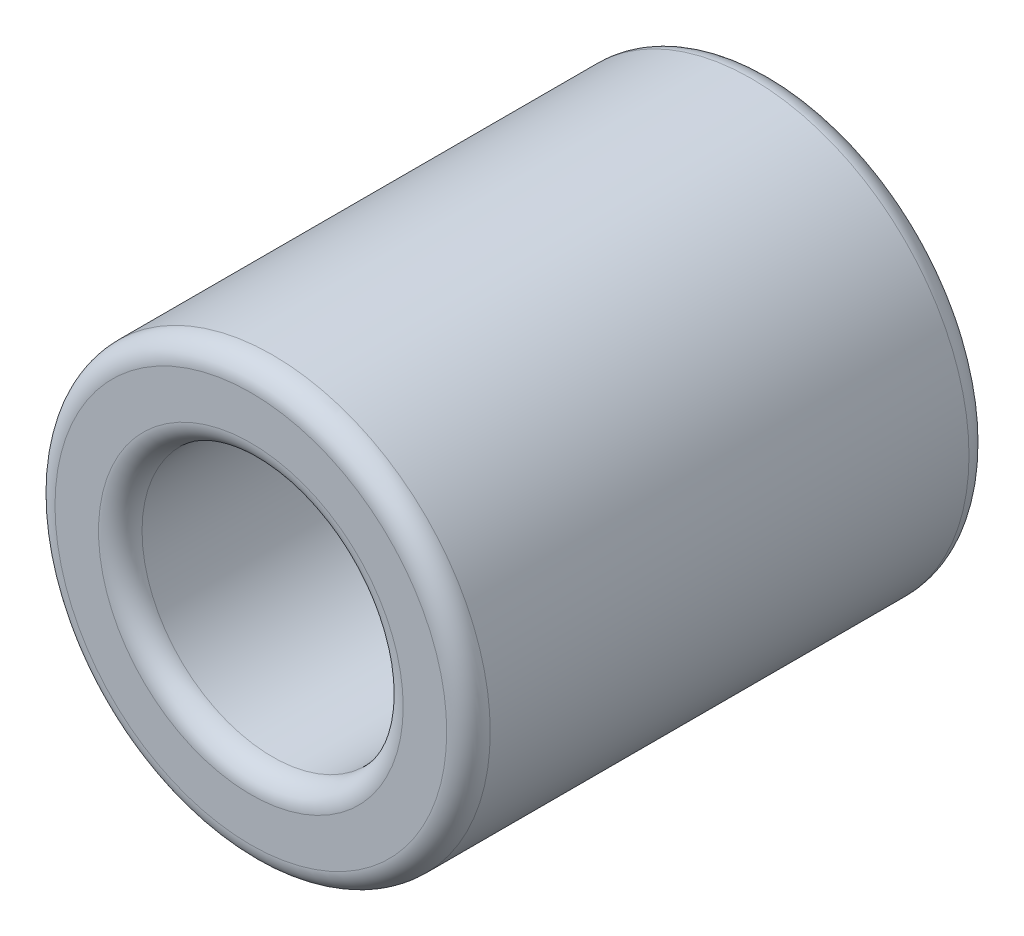
ISO-10303-21;
HEADER;
FILE_DESCRIPTION(('STEP AP214'),'2;1');
FILE_NAME('part.step','',(''),(''),'','','');
FILE_SCHEMA(('AUTOMOTIVE_DESIGN { 1 0 10303 214 1 1 1 1 }'));
ENDSEC;
DATA;
#1=APPLICATION_CONTEXT('core data for automotive mechanical design processes');
#2=APPLICATION_PROTOCOL_DEFINITION('international standard','automotive_design',2000,#1);
#3=PRODUCT_CONTEXT('',#1,'mechanical');
#4=PRODUCT('Part','Part','',(#3));
#5=PRODUCT_RELATED_PRODUCT_CATEGORY('part','',(#4));
#6=PRODUCT_DEFINITION_FORMATION('','',#4);
#7=PRODUCT_DEFINITION_CONTEXT('part definition',#1,'design');
#8=PRODUCT_DEFINITION('design','',#6,#7);
#9=PRODUCT_DEFINITION_SHAPE('','',#8);
#10=(LENGTH_UNIT() NAMED_UNIT(*) SI_UNIT(.MILLI.,.METRE.));
#11=(NAMED_UNIT(*) PLANE_ANGLE_UNIT() SI_UNIT($,.RADIAN.));
#12=(NAMED_UNIT(*) SI_UNIT($,.STERADIAN.) SOLID_ANGLE_UNIT());
#13=UNCERTAINTY_MEASURE_WITH_UNIT(LENGTH_MEASURE(1.E-05),#10,'distance_accuracy_value','');
#14=(GEOMETRIC_REPRESENTATION_CONTEXT(3) GLOBAL_UNCERTAINTY_ASSIGNED_CONTEXT((#13)) GLOBAL_UNIT_ASSIGNED_CONTEXT((#10,
#11,#12)) REPRESENTATION_CONTEXT('',''));
#15=CARTESIAN_POINT('',(0.,0.,0.));
#16=DIRECTION('',(0.,0.,1.));
#17=DIRECTION('',(1.,0.,0.));
#18=AXIS2_PLACEMENT_3D('',#15,#16,#17);
#19=CARTESIAN_POINT('',(0.,0.,12.));
#20=DIRECTION('',(0.,0.,1.));
#21=DIRECTION('',(1.,0.,0.));
#22=AXIS2_PLACEMENT_3D('',#19,#20,#21);
#23=PLANE('',#22);
#24=CARTESIAN_POINT('',(0.,0.,12.));
#25=DIRECTION('',(0.,0.,1.));
#26=DIRECTION('',(1.,0.,0.));
#27=AXIS2_PLACEMENT_3D('',#24,#25,#26);
#28=CIRCLE('',#27,3.5);
#29=CARTESIAN_POINT('',(3.5,0.,12.));
#30=VERTEX_POINT('',#29);
#31=EDGE_CURVE('E10',#30,#30,#28,.F.);
#32=ORIENTED_EDGE('',*,*,#31,.T.);
#33=EDGE_LOOP('',(#32));
#34=FACE_BOUND('',#33,.T.);
#35=CARTESIAN_POINT('',(0.,0.,12.));
#36=DIRECTION('',(0.,0.,1.));
#37=DIRECTION('',(1.,0.,0.));
#38=AXIS2_PLACEMENT_3D('',#35,#36,#37);
#39=CIRCLE('',#38,4.5);
#40=CARTESIAN_POINT('',(4.5,0.,12.));
#41=VERTEX_POINT('',#40);
#42=EDGE_CURVE('E48',#41,#41,#39,.T.);
#43=ORIENTED_EDGE('',*,*,#42,.T.);
#44=EDGE_LOOP('',(#43));
#45=FACE_BOUND('',#44,.T.);
#46=ADVANCED_FACE('F41',(#34,#45),#23,.T.);
#47=CARTESIAN_POINT('',(0.,0.,0.));
#48=DIRECTION('',(0.,0.,1.));
#49=DIRECTION('',(1.,0.,0.));
#50=AXIS2_PLACEMENT_3D('',#47,#48,#49);
#51=PLANE('',#50);
#52=CARTESIAN_POINT('',(0.,0.,0.));
#53=DIRECTION('',(0.,0.,1.));
#54=DIRECTION('',(1.,0.,0.));
#55=AXIS2_PLACEMENT_3D('',#52,#53,#54);
#56=CIRCLE('',#55,3.5);
#57=CARTESIAN_POINT('',(3.5,0.,0.));
#58=VERTEX_POINT('',#57);
#59=EDGE_CURVE('E67',#58,#58,#56,.T.);
#60=ORIENTED_EDGE('',*,*,#59,.T.);
#61=EDGE_LOOP('',(#60));
#62=FACE_BOUND('',#61,.T.);
#63=CARTESIAN_POINT('',(0.,0.,0.));
#64=DIRECTION('',(0.,0.,1.));
#65=DIRECTION('',(1.,0.,0.));
#66=AXIS2_PLACEMENT_3D('',#63,#64,#65);
#67=CIRCLE('',#66,4.5);
#68=CARTESIAN_POINT('',(4.5,0.,0.));
#69=VERTEX_POINT('',#68);
#70=EDGE_CURVE('E70',#69,#69,#67,.F.);
#71=ORIENTED_EDGE('',*,*,#70,.T.);
#72=EDGE_LOOP('',(#71));
#73=FACE_BOUND('',#72,.T.);
#74=ADVANCED_FACE('F74',(#62,#73),#51,.F.);
#75=CARTESIAN_POINT('',(0.,0.,12.));
#76=DIRECTION('',(0.,0.,-1.));
#77=DIRECTION('',(-1.,0.,0.));
#78=AXIS2_PLACEMENT_3D('',#75,#76,#77);
#79=CYLINDRICAL_SURFACE('',#78,5.);
#80=CARTESIAN_POINT('',(0.,0.,0.5));
#81=DIRECTION('',(0.,0.,1.));
#82=DIRECTION('',(1.,0.,0.));
#83=AXIS2_PLACEMENT_3D('',#80,#81,#82);
#84=CIRCLE('',#83,5.);
#85=CARTESIAN_POINT('',(5.,0.,0.5));
#86=VERTEX_POINT('',#85);
#87=EDGE_CURVE('E52',#86,#86,#84,.T.);
#88=ORIENTED_EDGE('',*,*,#87,.T.);
#89=EDGE_LOOP('',(#88));
#90=FACE_BOUND('',#89,.T.);
#91=CARTESIAN_POINT('',(0.,0.,11.5));
#92=DIRECTION('',(0.,0.,1.));
#93=DIRECTION('',(1.,0.,0.));
#94=AXIS2_PLACEMENT_3D('',#91,#92,#93);
#95=CIRCLE('',#94,5.);
#96=CARTESIAN_POINT('',(5.,0.,11.5));
#97=VERTEX_POINT('',#96);
#98=EDGE_CURVE('E56',#97,#97,#95,.F.);
#99=ORIENTED_EDGE('',*,*,#98,.T.);
#100=EDGE_LOOP('',(#99));
#101=FACE_BOUND('',#100,.T.);
#102=ADVANCED_FACE('F84',(#90,#101),#79,.T.);
#103=CARTESIAN_POINT('',(0.,0.,12.));
#104=DIRECTION('',(0.,0.,-1.));
#105=DIRECTION('',(-1.,0.,0.));
#106=AXIS2_PLACEMENT_3D('',#103,#104,#105);
#107=CYLINDRICAL_SURFACE('',#106,3.);
#108=CARTESIAN_POINT('',(0.,0.,0.5));
#109=DIRECTION('',(0.,0.,1.));
#110=DIRECTION('',(1.,0.,0.));
#111=AXIS2_PLACEMENT_3D('',#108,#109,#110);
#112=CIRCLE('',#111,3.);
#113=CARTESIAN_POINT('',(3.,0.,0.5));
#114=VERTEX_POINT('',#113);
#115=EDGE_CURVE('E61',#114,#114,#112,.F.);
#116=ORIENTED_EDGE('',*,*,#115,.T.);
#117=EDGE_LOOP('',(#116));
#118=FACE_BOUND('',#117,.T.);
#119=CARTESIAN_POINT('',(0.,0.,11.5));
#120=DIRECTION('',(0.,0.,1.));
#121=DIRECTION('',(1.,0.,0.));
#122=AXIS2_PLACEMENT_3D('',#119,#120,#121);
#123=CIRCLE('',#122,3.);
#124=CARTESIAN_POINT('',(3.,0.,11.5));
#125=VERTEX_POINT('',#124);
#126=EDGE_CURVE('E64',#125,#125,#123,.T.);
#127=ORIENTED_EDGE('',*,*,#126,.T.);
#128=EDGE_LOOP('',(#127));
#129=FACE_BOUND('',#128,.T.);
#130=ADVANCED_FACE('F87',(#118,#129),#107,.F.);
#131=CARTESIAN_POINT('',(0.,0.,0.5));
#132=DIRECTION('',(0.,0.,1.));
#133=DIRECTION('',(1.,0.,0.));
#134=AXIS2_PLACEMENT_3D('',#131,#132,#133);
#135=TOROIDAL_SURFACE('',#134,3.5,0.5);
#136=ORIENTED_EDGE('',*,*,#115,.F.);
#137=EDGE_LOOP('',(#136));
#138=FACE_BOUND('',#137,.T.);
#139=ORIENTED_EDGE('',*,*,#59,.F.);
#140=EDGE_LOOP('',(#139));
#141=FACE_BOUND('',#140,.T.);
#142=ADVANCED_FACE('F80',(#138,#141),#135,.T.);
#143=CARTESIAN_POINT('',(0.,0.,0.5));
#144=DIRECTION('',(0.,0.,1.));
#145=DIRECTION('',(1.,0.,0.));
#146=AXIS2_PLACEMENT_3D('',#143,#144,#145);
#147=TOROIDAL_SURFACE('',#146,4.5,0.5);
#148=ORIENTED_EDGE('',*,*,#70,.F.);
#149=EDGE_LOOP('',(#148));
#150=FACE_BOUND('',#149,.T.);
#151=ORIENTED_EDGE('',*,*,#87,.F.);
#152=EDGE_LOOP('',(#151));
#153=FACE_BOUND('',#152,.T.);
#154=ADVANCED_FACE('F76',(#150,#153),#147,.T.);
#155=CARTESIAN_POINT('',(0.,0.,11.5));
#156=DIRECTION('',(0.,0.,1.));
#157=DIRECTION('',(1.,0.,0.));
#158=AXIS2_PLACEMENT_3D('',#155,#156,#157);
#159=TOROIDAL_SURFACE('',#158,3.5,0.5);
#160=ORIENTED_EDGE('',*,*,#31,.F.);
#161=EDGE_LOOP('',(#160));
#162=FACE_BOUND('',#161,.T.);
#163=ORIENTED_EDGE('',*,*,#126,.F.);
#164=EDGE_LOOP('',(#163));
#165=FACE_BOUND('',#164,.T.);
#166=ADVANCED_FACE('F79',(#162,#165),#159,.T.);
#167=CARTESIAN_POINT('',(0.,0.,11.5));
#168=DIRECTION('',(0.,0.,1.));
#169=DIRECTION('',(1.,0.,0.));
#170=AXIS2_PLACEMENT_3D('',#167,#168,#169);
#171=TOROIDAL_SURFACE('',#170,4.5,0.5);
#172=ORIENTED_EDGE('',*,*,#98,.F.);
#173=EDGE_LOOP('',(#172));
#174=FACE_BOUND('',#173,.T.);
#175=ORIENTED_EDGE('',*,*,#42,.F.);
#176=EDGE_LOOP('',(#175));
#177=FACE_BOUND('',#176,.T.);
#178=ADVANCED_FACE('F43',(#174,#177),#171,.T.);
#179=CLOSED_SHELL('',(#46,#74,#102,#130,#142,#154,#166,#178));
#180=MANIFOLD_SOLID_BREP('B2',#179);
#181=ADVANCED_BREP_SHAPE_REPRESENTATION('',(#18,#180),#14);
#182=SHAPE_DEFINITION_REPRESENTATION(#9,#181);
ENDSEC;
END-ISO-10303-21;
